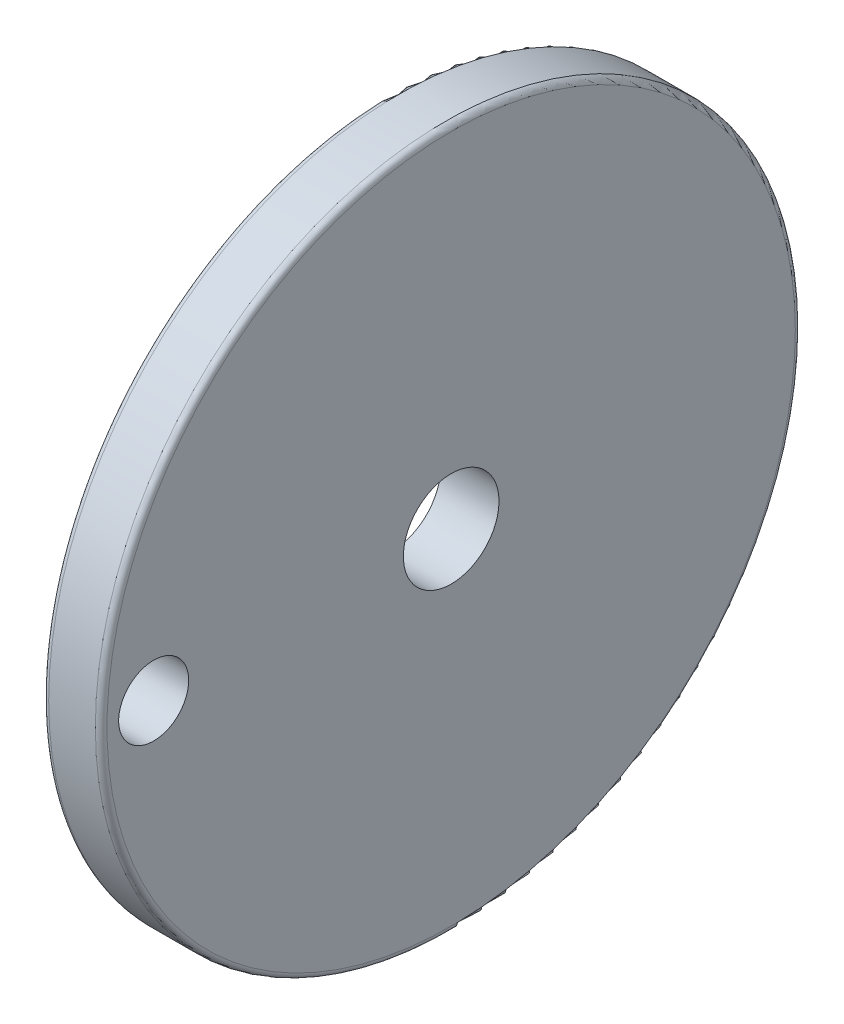
ISO-10303-21;
HEADER;
FILE_DESCRIPTION(('STEP AP214'),'2;1');
FILE_NAME('part.step','',(''),(''),'','','');
FILE_SCHEMA(('AUTOMOTIVE_DESIGN { 1 0 10303 214 1 1 1 1 }'));
ENDSEC;
DATA;
#1=APPLICATION_CONTEXT('core data for automotive mechanical design processes');
#2=APPLICATION_PROTOCOL_DEFINITION('international standard','automotive_design',2000,#1);
#3=PRODUCT_CONTEXT('',#1,'mechanical');
#4=PRODUCT('Part','Part','',(#3));
#5=PRODUCT_RELATED_PRODUCT_CATEGORY('part','',(#4));
#6=PRODUCT_DEFINITION_FORMATION('','',#4);
#7=PRODUCT_DEFINITION_CONTEXT('part definition',#1,'design');
#8=PRODUCT_DEFINITION('design','',#6,#7);
#9=PRODUCT_DEFINITION_SHAPE('','',#8);
#10=(LENGTH_UNIT() NAMED_UNIT(*) SI_UNIT(.MILLI.,.METRE.));
#11=(NAMED_UNIT(*) PLANE_ANGLE_UNIT() SI_UNIT($,.RADIAN.));
#12=(NAMED_UNIT(*) SI_UNIT($,.STERADIAN.) SOLID_ANGLE_UNIT());
#13=UNCERTAINTY_MEASURE_WITH_UNIT(LENGTH_MEASURE(1.E-05),#10,'distance_accuracy_value','');
#14=(GEOMETRIC_REPRESENTATION_CONTEXT(3) GLOBAL_UNCERTAINTY_ASSIGNED_CONTEXT((#13)) GLOBAL_UNIT_ASSIGNED_CONTEXT((#10,
#11,#12)) REPRESENTATION_CONTEXT('',''));
#15=CARTESIAN_POINT('',(0.,0.,0.));
#16=DIRECTION('',(0.,0.,1.));
#17=DIRECTION('',(1.,0.,0.));
#18=AXIS2_PLACEMENT_3D('',#15,#16,#17);
#19=CARTESIAN_POINT('',(5.,0.,0.));
#20=DIRECTION('',(1.,0.,0.));
#21=DIRECTION('',(0.,0.,-1.));
#22=AXIS2_PLACEMENT_3D('',#19,#20,#21);
#23=PLANE('',#22);
#24=CARTESIAN_POINT('',(5.,0.,0.));
#25=DIRECTION('',(1.,0.,0.));
#26=DIRECTION('',(0.,0.,-1.));
#27=AXIS2_PLACEMENT_3D('',#24,#25,#26);
#28=CIRCLE('',#27,29.5);
#29=CARTESIAN_POINT('',(5.,0.,-29.5));
#30=VERTEX_POINT('',#29);
#31=EDGE_CURVE('E61',#30,#30,#28,.T.);
#32=ORIENTED_EDGE('',*,*,#31,.T.);
#33=EDGE_LOOP('',(#32));
#34=FACE_BOUND('',#33,.T.);
#35=CARTESIAN_POINT('',(5.,0.,25.5));
#36=DIRECTION('',(1.,0.,0.));
#37=DIRECTION('',(0.,0.,-1.));
#38=AXIS2_PLACEMENT_3D('',#35,#36,#37);
#39=CIRCLE('',#38,3.);
#40=CARTESIAN_POINT('',(5.,0.,22.5));
#41=VERTEX_POINT('',#40);
#42=EDGE_CURVE('E67',#41,#41,#39,.T.);
#43=ORIENTED_EDGE('',*,*,#42,.F.);
#44=EDGE_LOOP('',(#43));
#45=FACE_BOUND('',#44,.T.);
#46=CARTESIAN_POINT('',(5.,0.,0.));
#47=DIRECTION('',(1.,0.,0.));
#48=DIRECTION('',(0.,0.,-1.));
#49=AXIS2_PLACEMENT_3D('',#46,#47,#48);
#50=CIRCLE('',#49,4.1);
#51=CARTESIAN_POINT('',(5.,0.,-4.1));
#52=VERTEX_POINT('',#51);
#53=EDGE_CURVE('E72',#52,#52,#50,.T.);
#54=ORIENTED_EDGE('',*,*,#53,.F.);
#55=EDGE_LOOP('',(#54));
#56=FACE_BOUND('',#55,.T.);
#57=ADVANCED_FACE('F43',(#34,#45,#56),#23,.T.);
#58=CARTESIAN_POINT('',(0.,0.,0.));
#59=DIRECTION('',(1.,0.,0.));
#60=DIRECTION('',(0.,0.,-1.));
#61=AXIS2_PLACEMENT_3D('',#58,#59,#60);
#62=PLANE('',#61);
#63=CARTESIAN_POINT('',(0.,0.,0.));
#64=DIRECTION('',(1.,0.,0.));
#65=DIRECTION('',(0.,0.,-1.));
#66=AXIS2_PLACEMENT_3D('',#63,#64,#65);
#67=CIRCLE('',#66,29.5);
#68=CARTESIAN_POINT('',(0.,0.,-29.5));
#69=VERTEX_POINT('',#68);
#70=EDGE_CURVE('E10',#69,#69,#67,.F.);
#71=ORIENTED_EDGE('',*,*,#70,.T.);
#72=EDGE_LOOP('',(#71));
#73=FACE_BOUND('',#72,.T.);
#74=CARTESIAN_POINT('',(0.,0.,25.5));
#75=DIRECTION('',(1.,0.,0.));
#76=DIRECTION('',(0.,0.,-1.));
#77=AXIS2_PLACEMENT_3D('',#74,#75,#76);
#78=CIRCLE('',#77,3.);
#79=CARTESIAN_POINT('',(0.,0.,22.5));
#80=VERTEX_POINT('',#79);
#81=EDGE_CURVE('E68',#80,#80,#78,.T.);
#82=ORIENTED_EDGE('',*,*,#81,.T.);
#83=EDGE_LOOP('',(#82));
#84=FACE_BOUND('',#83,.T.);
#85=CARTESIAN_POINT('',(0.,0.,0.));
#86=DIRECTION('',(1.,0.,0.));
#87=DIRECTION('',(0.,0.,-1.));
#88=AXIS2_PLACEMENT_3D('',#85,#86,#87);
#89=CIRCLE('',#88,4.1);
#90=CARTESIAN_POINT('',(0.,0.,-4.1));
#91=VERTEX_POINT('',#90);
#92=EDGE_CURVE('E76',#91,#91,#89,.T.);
#93=ORIENTED_EDGE('',*,*,#92,.T.);
#94=EDGE_LOOP('',(#93));
#95=FACE_BOUND('',#94,.T.);
#96=ADVANCED_FACE('F88',(#73,#84,#95),#62,.F.);
#97=CARTESIAN_POINT('',(5.,0.,0.));
#98=DIRECTION('',(-1.,0.,0.));
#99=DIRECTION('',(0.,0.,1.));
#100=AXIS2_PLACEMENT_3D('',#97,#98,#99);
#101=CYLINDRICAL_SURFACE('',#100,30.);
#102=CARTESIAN_POINT('',(4.5,0.,0.));
#103=DIRECTION('',(1.,0.,0.));
#104=DIRECTION('',(0.,0.,-1.));
#105=AXIS2_PLACEMENT_3D('',#102,#103,#104);
#106=CIRCLE('',#105,30.);
#107=CARTESIAN_POINT('',(4.5,0.,-30.));
#108=VERTEX_POINT('',#107);
#109=EDGE_CURVE('E51',#108,#108,#106,.F.);
#110=ORIENTED_EDGE('',*,*,#109,.T.);
#111=EDGE_LOOP('',(#110));
#112=FACE_BOUND('',#111,.T.);
#113=CARTESIAN_POINT('',(0.5,0.,0.));
#114=DIRECTION('',(1.,0.,0.));
#115=DIRECTION('',(0.,0.,-1.));
#116=AXIS2_PLACEMENT_3D('',#113,#114,#115);
#117=CIRCLE('',#116,30.);
#118=CARTESIAN_POINT('',(0.5,0.,-30.));
#119=VERTEX_POINT('',#118);
#120=EDGE_CURVE('E56',#119,#119,#117,.T.);
#121=ORIENTED_EDGE('',*,*,#120,.T.);
#122=EDGE_LOOP('',(#121));
#123=FACE_BOUND('',#122,.T.);
#124=ADVANCED_FACE('F95',(#112,#123),#101,.T.);
#125=CARTESIAN_POINT('',(5.,0.,25.5));
#126=DIRECTION('',(-1.,0.,0.));
#127=DIRECTION('',(0.,0.,1.));
#128=AXIS2_PLACEMENT_3D('',#125,#126,#127);
#129=CYLINDRICAL_SURFACE('',#128,3.);
#130=ORIENTED_EDGE('',*,*,#42,.T.);
#131=EDGE_LOOP('',(#130));
#132=FACE_BOUND('',#131,.T.);
#133=ORIENTED_EDGE('',*,*,#81,.F.);
#134=EDGE_LOOP('',(#133));
#135=FACE_BOUND('',#134,.T.);
#136=ADVANCED_FACE('F99',(#132,#135),#129,.F.);
#137=CARTESIAN_POINT('',(5.,0.,0.));
#138=DIRECTION('',(-1.,0.,0.));
#139=DIRECTION('',(0.,0.,1.));
#140=AXIS2_PLACEMENT_3D('',#137,#138,#139);
#141=CYLINDRICAL_SURFACE('',#140,4.1);
#142=ORIENTED_EDGE('',*,*,#53,.T.);
#143=EDGE_LOOP('',(#142));
#144=FACE_BOUND('',#143,.T.);
#145=ORIENTED_EDGE('',*,*,#92,.F.);
#146=EDGE_LOOP('',(#145));
#147=FACE_BOUND('',#146,.T.);
#148=ADVANCED_FACE('F84',(#144,#147),#141,.F.);
#149=CARTESIAN_POINT('',(4.5,0.,0.));
#150=DIRECTION('',(1.,0.,0.));
#151=DIRECTION('',(0.,0.,-1.));
#152=AXIS2_PLACEMENT_3D('',#149,#150,#151);
#153=TOROIDAL_SURFACE('',#152,29.5,0.5);
#154=ORIENTED_EDGE('',*,*,#109,.F.);
#155=EDGE_LOOP('',(#154));
#156=FACE_BOUND('',#155,.T.);
#157=ORIENTED_EDGE('',*,*,#31,.F.);
#158=EDGE_LOOP('',(#157));
#159=FACE_BOUND('',#158,.T.);
#160=ADVANCED_FACE('F103',(#156,#159),#153,.T.);
#161=CARTESIAN_POINT('',(0.5,0.,0.));
#162=DIRECTION('',(1.,0.,0.));
#163=DIRECTION('',(0.,0.,-1.));
#164=AXIS2_PLACEMENT_3D('',#161,#162,#163);
#165=TOROIDAL_SURFACE('',#164,29.5,0.5);
#166=ORIENTED_EDGE('',*,*,#70,.F.);
#167=EDGE_LOOP('',(#166));
#168=FACE_BOUND('',#167,.T.);
#169=ORIENTED_EDGE('',*,*,#120,.F.);
#170=EDGE_LOOP('',(#169));
#171=FACE_BOUND('',#170,.T.);
#172=ADVANCED_FACE('F45',(#168,#171),#165,.T.);
#173=CLOSED_SHELL('',(#57,#96,#124,#136,#148,#160,#172));
#174=MANIFOLD_SOLID_BREP('B2',#173);
#175=ADVANCED_BREP_SHAPE_REPRESENTATION('',(#18,#174),#14);
#176=SHAPE_DEFINITION_REPRESENTATION(#9,#175);
ENDSEC;
END-ISO-10303-21;
